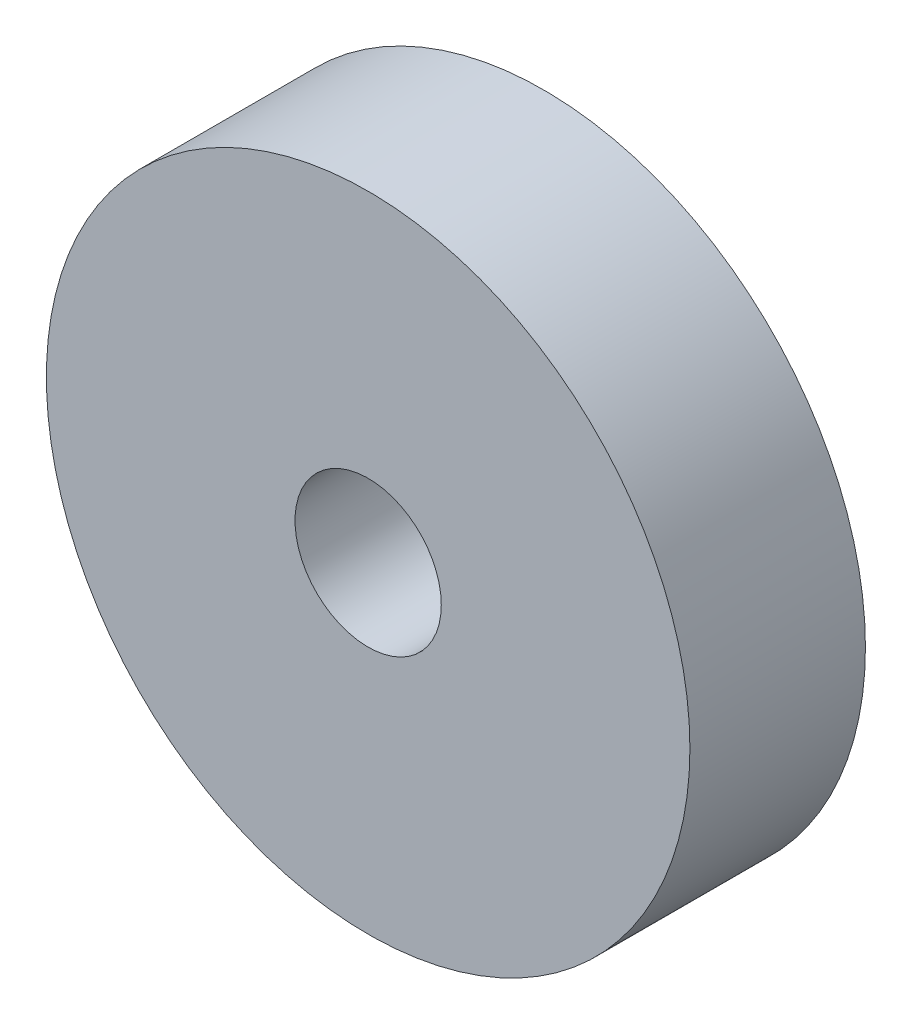
ISO-10303-21;
HEADER;
FILE_DESCRIPTION(('STEP AP214'),'2;1');
FILE_NAME('part.step','',(''),(''),'','','');
FILE_SCHEMA(('AUTOMOTIVE_DESIGN { 1 0 10303 214 1 1 1 1 }'));
ENDSEC;
DATA;
#1=APPLICATION_CONTEXT('core data for automotive mechanical design processes');
#2=APPLICATION_PROTOCOL_DEFINITION('international standard','automotive_design',2000,#1);
#3=PRODUCT_CONTEXT('',#1,'mechanical');
#4=PRODUCT('Part','Part','',(#3));
#5=PRODUCT_RELATED_PRODUCT_CATEGORY('part','',(#4));
#6=PRODUCT_DEFINITION_FORMATION('','',#4);
#7=PRODUCT_DEFINITION_CONTEXT('part definition',#1,'design');
#8=PRODUCT_DEFINITION('design','',#6,#7);
#9=PRODUCT_DEFINITION_SHAPE('','',#8);
#10=(LENGTH_UNIT() NAMED_UNIT(*) SI_UNIT(.MILLI.,.METRE.));
#11=(NAMED_UNIT(*) PLANE_ANGLE_UNIT() SI_UNIT($,.RADIAN.));
#12=(NAMED_UNIT(*) SI_UNIT($,.STERADIAN.) SOLID_ANGLE_UNIT());
#13=UNCERTAINTY_MEASURE_WITH_UNIT(LENGTH_MEASURE(1.E-05),#10,'distance_accuracy_value','');
#14=(GEOMETRIC_REPRESENTATION_CONTEXT(3) GLOBAL_UNCERTAINTY_ASSIGNED_CONTEXT((#13)) GLOBAL_UNIT_ASSIGNED_CONTEXT((#10,
#11,#12)) REPRESENTATION_CONTEXT('',''));
#15=CARTESIAN_POINT('',(0.,0.,0.));
#16=DIRECTION('',(0.,0.,1.));
#17=DIRECTION('',(1.,0.,0.));
#18=AXIS2_PLACEMENT_3D('',#15,#16,#17);
#19=CARTESIAN_POINT('',(0.,0.,3.));
#20=DIRECTION('',(0.,0.,1.));
#21=DIRECTION('',(1.,0.,0.));
#22=AXIS2_PLACEMENT_3D('',#19,#20,#21);
#23=PLANE('',#22);
#24=CARTESIAN_POINT('',(0.,0.,3.));
#25=DIRECTION('',(0.,0.,1.));
#26=DIRECTION('',(1.,0.,0.));
#27=AXIS2_PLACEMENT_3D('',#24,#25,#26);
#28=CIRCLE('',#27,5.5);
#29=CARTESIAN_POINT('',(5.5,0.,3.));
#30=VERTEX_POINT('',#29);
#31=EDGE_CURVE('E10',#30,#30,#28,.T.);
#32=ORIENTED_EDGE('',*,*,#31,.T.);
#33=EDGE_LOOP('',(#32));
#34=FACE_BOUND('',#33,.T.);
#35=CARTESIAN_POINT('',(0.,0.,3.));
#36=DIRECTION('',(0.,0.,1.));
#37=DIRECTION('',(1.,0.,0.));
#38=AXIS2_PLACEMENT_3D('',#35,#36,#37);
#39=CIRCLE('',#38,1.25);
#40=CARTESIAN_POINT('',(1.25,0.,3.));
#41=VERTEX_POINT('',#40);
#42=EDGE_CURVE('E41',#41,#41,#39,.T.);
#43=ORIENTED_EDGE('',*,*,#42,.F.);
#44=EDGE_LOOP('',(#43));
#45=FACE_BOUND('',#44,.T.);
#46=ADVANCED_FACE('F30',(#34,#45),#23,.T.);
#47=CARTESIAN_POINT('',(0.,0.,0.));
#48=DIRECTION('',(0.,0.,1.));
#49=DIRECTION('',(1.,0.,0.));
#50=AXIS2_PLACEMENT_3D('',#47,#48,#49);
#51=PLANE('',#50);
#52=CARTESIAN_POINT('',(0.,0.,0.));
#53=DIRECTION('',(0.,0.,1.));
#54=DIRECTION('',(1.,0.,0.));
#55=AXIS2_PLACEMENT_3D('',#52,#53,#54);
#56=CIRCLE('',#55,5.5);
#57=CARTESIAN_POINT('',(5.5,0.,0.));
#58=VERTEX_POINT('',#57);
#59=EDGE_CURVE('E34',#58,#58,#56,.T.);
#60=ORIENTED_EDGE('',*,*,#59,.F.);
#61=EDGE_LOOP('',(#60));
#62=FACE_BOUND('',#61,.T.);
#63=CARTESIAN_POINT('',(0.,0.,0.));
#64=DIRECTION('',(0.,0.,1.));
#65=DIRECTION('',(1.,0.,0.));
#66=AXIS2_PLACEMENT_3D('',#63,#64,#65);
#67=CIRCLE('',#66,1.25);
#68=CARTESIAN_POINT('',(1.25,0.,0.));
#69=VERTEX_POINT('',#68);
#70=EDGE_CURVE('E43',#69,#69,#67,.T.);
#71=ORIENTED_EDGE('',*,*,#70,.T.);
#72=EDGE_LOOP('',(#71));
#73=FACE_BOUND('',#72,.T.);
#74=ADVANCED_FACE('F53',(#62,#73),#51,.F.);
#75=CARTESIAN_POINT('',(0.,0.,3.));
#76=DIRECTION('',(0.,0.,-1.));
#77=DIRECTION('',(-1.,0.,0.));
#78=AXIS2_PLACEMENT_3D('',#75,#76,#77);
#79=CYLINDRICAL_SURFACE('',#78,5.5);
#80=ORIENTED_EDGE('',*,*,#31,.F.);
#81=EDGE_LOOP('',(#80));
#82=FACE_BOUND('',#81,.T.);
#83=ORIENTED_EDGE('',*,*,#59,.T.);
#84=EDGE_LOOP('',(#83));
#85=FACE_BOUND('',#84,.T.);
#86=ADVANCED_FACE('F32',(#82,#85),#79,.T.);
#87=CARTESIAN_POINT('',(0.,0.,3.));
#88=DIRECTION('',(0.,0.,-1.));
#89=DIRECTION('',(-1.,0.,0.));
#90=AXIS2_PLACEMENT_3D('',#87,#88,#89);
#91=CYLINDRICAL_SURFACE('',#90,1.25);
#92=ORIENTED_EDGE('',*,*,#42,.T.);
#93=EDGE_LOOP('',(#92));
#94=FACE_BOUND('',#93,.T.);
#95=ORIENTED_EDGE('',*,*,#70,.F.);
#96=EDGE_LOOP('',(#95));
#97=FACE_BOUND('',#96,.T.);
#98=ADVANCED_FACE('F49',(#94,#97),#91,.F.);
#99=CLOSED_SHELL('',(#46,#74,#86,#98));
#100=MANIFOLD_SOLID_BREP('B2',#99);
#101=ADVANCED_BREP_SHAPE_REPRESENTATION('',(#18,#100),#14);
#102=SHAPE_DEFINITION_REPRESENTATION(#9,#101);
ENDSEC;
END-ISO-10303-21;
